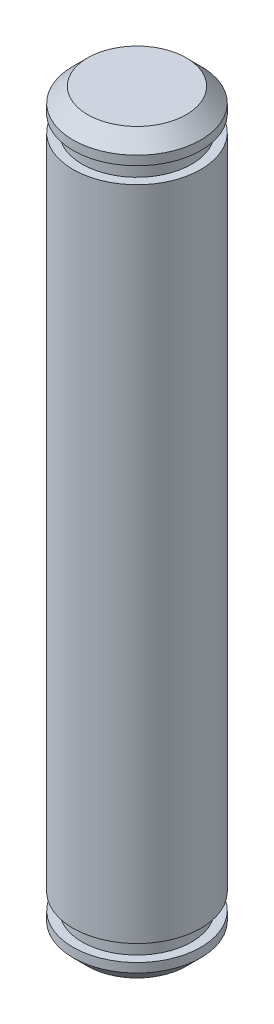
ISO-10303-21;
HEADER;
FILE_DESCRIPTION(('STEP AP214'),'2;1');
FILE_NAME('part.step','',(''),(''),'','','');
FILE_SCHEMA(('AUTOMOTIVE_DESIGN { 1 0 10303 214 1 1 1 1 }'));
ENDSEC;
DATA;
#1=APPLICATION_CONTEXT('core data for automotive mechanical design processes');
#2=APPLICATION_PROTOCOL_DEFINITION('international standard','automotive_design',2000,#1);
#3=PRODUCT_CONTEXT('',#1,'mechanical');
#4=PRODUCT('Part','Part','',(#3));
#5=PRODUCT_RELATED_PRODUCT_CATEGORY('part','',(#4));
#6=PRODUCT_DEFINITION_FORMATION('','',#4);
#7=PRODUCT_DEFINITION_CONTEXT('part definition',#1,'design');
#8=PRODUCT_DEFINITION('design','',#6,#7);
#9=PRODUCT_DEFINITION_SHAPE('','',#8);
#10=(LENGTH_UNIT() NAMED_UNIT(*) SI_UNIT(.MILLI.,.METRE.));
#11=(NAMED_UNIT(*) PLANE_ANGLE_UNIT() SI_UNIT($,.RADIAN.));
#12=(NAMED_UNIT(*) SI_UNIT($,.STERADIAN.) SOLID_ANGLE_UNIT());
#13=UNCERTAINTY_MEASURE_WITH_UNIT(LENGTH_MEASURE(1.E-05),#10,'distance_accuracy_value','');
#14=(GEOMETRIC_REPRESENTATION_CONTEXT(3) GLOBAL_UNCERTAINTY_ASSIGNED_CONTEXT((#13)) GLOBAL_UNIT_ASSIGNED_CONTEXT((#10,
#11,#12)) REPRESENTATION_CONTEXT('',''));
#15=CARTESIAN_POINT('',(0.,0.,0.));
#16=DIRECTION('',(0.,0.,1.));
#17=DIRECTION('',(1.,0.,0.));
#18=AXIS2_PLACEMENT_3D('',#15,#16,#17);
#19=CARTESIAN_POINT('',(0.689396407424145,-20.2,2.61050427952737));
#20=DIRECTION('',(0.,-1.,0.));
#21=DIRECTION('',(0.,0.,-1.));
#22=AXIS2_PLACEMENT_3D('',#19,#20,#21);
#23=PLANE('',#22);
#24=CARTESIAN_POINT('',(0.,-20.2,0.));
#25=DIRECTION('',(0.,1.,0.));
#26=DIRECTION('',(0.,0.,1.));
#27=AXIS2_PLACEMENT_3D('',#24,#25,#26);
#28=CIRCLE('',#27,2.7);
#29=CARTESIAN_POINT('',(0.,-20.2,2.7));
#30=VERTEX_POINT('',#29);
#31=EDGE_CURVE('E12',#30,#30,#28,.T.);
#32=ORIENTED_EDGE('',*,*,#31,.F.);
#33=EDGE_LOOP('',(#32));
#34=FACE_BOUND('',#33,.T.);
#35=ADVANCED_FACE('F39',(#34),#23,.T.);
#36=CARTESIAN_POINT('',(0.,-19.4,0.));
#37=DIRECTION('',(0.,1.,0.));
#38=DIRECTION('',(0.,0.,1.));
#39=AXIS2_PLACEMENT_3D('',#36,#37,#38);
#40=CONICAL_SURFACE('',#39,3.5,0.785398163397447);
#41=ORIENTED_EDGE('',*,*,#31,.T.);
#42=EDGE_LOOP('',(#41));
#43=FACE_BOUND('',#42,.T.);
#44=CARTESIAN_POINT('',(0.,-19.4,0.));
#45=DIRECTION('',(0.,1.,0.));
#46=DIRECTION('',(0.,0.,1.));
#47=AXIS2_PLACEMENT_3D('',#44,#45,#46);
#48=CIRCLE('',#47,3.5);
#49=CARTESIAN_POINT('',(0.,-19.4,3.5));
#50=VERTEX_POINT('',#49);
#51=EDGE_CURVE('E45',#50,#50,#48,.T.);
#52=ORIENTED_EDGE('',*,*,#51,.F.);
#53=EDGE_LOOP('',(#52));
#54=FACE_BOUND('',#53,.T.);
#55=ADVANCED_FACE('F99',(#43,#54),#40,.T.);
#56=CARTESIAN_POINT('',(0.,0.,0.));
#57=DIRECTION('',(0.,1.,0.));
#58=DIRECTION('',(0.,0.,1.));
#59=AXIS2_PLACEMENT_3D('',#56,#57,#58);
#60=CYLINDRICAL_SURFACE('',#59,3.5);
#61=ORIENTED_EDGE('',*,*,#51,.T.);
#62=EDGE_LOOP('',(#61));
#63=FACE_BOUND('',#62,.T.);
#64=CARTESIAN_POINT('',(0.,-18.9,0.));
#65=DIRECTION('',(0.,1.,0.));
#66=DIRECTION('',(0.,0.,1.));
#67=AXIS2_PLACEMENT_3D('',#64,#65,#66);
#68=CIRCLE('',#67,3.5);
#69=CARTESIAN_POINT('',(0.,-18.9,3.5));
#70=VERTEX_POINT('',#69);
#71=EDGE_CURVE('E49',#70,#70,#68,.T.);
#72=ORIENTED_EDGE('',*,*,#71,.F.);
#73=EDGE_LOOP('',(#72));
#74=FACE_BOUND('',#73,.T.);
#75=ADVANCED_FACE('F104',(#63,#74),#60,.T.);
#76=CARTESIAN_POINT('',(0.765996008249045,-18.9,2.90056031058596));
#77=DIRECTION('',(0.,1.,0.));
#78=DIRECTION('',(0.,0.,1.));
#79=AXIS2_PLACEMENT_3D('',#76,#77,#78);
#80=PLANE('',#79);
#81=ORIENTED_EDGE('',*,*,#71,.T.);
#82=EDGE_LOOP('',(#81));
#83=FACE_BOUND('',#82,.T.);
#84=CARTESIAN_POINT('',(0.,-18.9,0.));
#85=DIRECTION('',(0.,1.,0.));
#86=DIRECTION('',(0.,0.,1.));
#87=AXIS2_PLACEMENT_3D('',#84,#85,#86);
#88=CIRCLE('',#87,3.);
#89=CARTESIAN_POINT('',(0.,-18.9,3.));
#90=VERTEX_POINT('',#89);
#91=EDGE_CURVE('E53',#90,#90,#88,.T.);
#92=ORIENTED_EDGE('',*,*,#91,.F.);
#93=EDGE_LOOP('',(#92));
#94=FACE_BOUND('',#93,.T.);
#95=ADVANCED_FACE('F108',(#83,#94),#80,.T.);
#96=CARTESIAN_POINT('',(0.,0.,0.));
#97=DIRECTION('',(0.,1.,0.));
#98=DIRECTION('',(0.,0.,1.));
#99=AXIS2_PLACEMENT_3D('',#96,#97,#98);
#100=CYLINDRICAL_SURFACE('',#99,3.);
#101=ORIENTED_EDGE('',*,*,#91,.T.);
#102=EDGE_LOOP('',(#101));
#103=FACE_BOUND('',#102,.T.);
#104=CARTESIAN_POINT('',(0.,-18.,0.));
#105=DIRECTION('',(0.,1.,0.));
#106=DIRECTION('',(0.,0.,1.));
#107=AXIS2_PLACEMENT_3D('',#104,#105,#106);
#108=CIRCLE('',#107,3.);
#109=CARTESIAN_POINT('',(0.,-18.,3.));
#110=VERTEX_POINT('',#109);
#111=EDGE_CURVE('E58',#110,#110,#108,.T.);
#112=ORIENTED_EDGE('',*,*,#111,.F.);
#113=EDGE_LOOP('',(#112));
#114=FACE_BOUND('',#113,.T.);
#115=ADVANCED_FACE('F114',(#103,#114),#100,.T.);
#116=CARTESIAN_POINT('',(0.893662009623888,-18.,3.38398702901696));
#117=DIRECTION('',(0.,-1.,0.));
#118=DIRECTION('',(0.,0.,-1.));
#119=AXIS2_PLACEMENT_3D('',#116,#117,#118);
#120=PLANE('',#119);
#121=ORIENTED_EDGE('',*,*,#111,.T.);
#122=EDGE_LOOP('',(#121));
#123=FACE_BOUND('',#122,.T.);
#124=CARTESIAN_POINT('',(0.,-18.,0.));
#125=DIRECTION('',(0.,1.,0.));
#126=DIRECTION('',(0.,0.,1.));
#127=AXIS2_PLACEMENT_3D('',#124,#125,#126);
#128=CIRCLE('',#127,3.5);
#129=CARTESIAN_POINT('',(0.,-18.,3.5));
#130=VERTEX_POINT('',#129);
#131=EDGE_CURVE('E61',#130,#130,#128,.T.);
#132=ORIENTED_EDGE('',*,*,#131,.F.);
#133=EDGE_LOOP('',(#132));
#134=FACE_BOUND('',#133,.T.);
#135=ADVANCED_FACE('F118',(#123,#134),#120,.T.);
#136=CARTESIAN_POINT('',(0.,0.,0.));
#137=DIRECTION('',(0.,1.,0.));
#138=DIRECTION('',(0.,0.,1.));
#139=AXIS2_PLACEMENT_3D('',#136,#137,#138);
#140=CYLINDRICAL_SURFACE('',#139,3.5);
#141=ORIENTED_EDGE('',*,*,#131,.T.);
#142=EDGE_LOOP('',(#141));
#143=FACE_BOUND('',#142,.T.);
#144=CARTESIAN_POINT('',(0.,18.,0.));
#145=DIRECTION('',(0.,1.,0.));
#146=DIRECTION('',(0.,0.,1.));
#147=AXIS2_PLACEMENT_3D('',#144,#145,#146);
#148=CIRCLE('',#147,3.5);
#149=CARTESIAN_POINT('',(0.,18.,3.5));
#150=VERTEX_POINT('',#149);
#151=EDGE_CURVE('E64',#150,#150,#148,.T.);
#152=ORIENTED_EDGE('',*,*,#151,.F.);
#153=EDGE_LOOP('',(#152));
#154=FACE_BOUND('',#153,.T.);
#155=ADVANCED_FACE('F122',(#143,#154),#140,.T.);
#156=CARTESIAN_POINT('',(0.893662009623888,18.,3.38398702901696));
#157=DIRECTION('',(0.,1.,0.));
#158=DIRECTION('',(0.,0.,1.));
#159=AXIS2_PLACEMENT_3D('',#156,#157,#158);
#160=PLANE('',#159);
#161=ORIENTED_EDGE('',*,*,#151,.T.);
#162=EDGE_LOOP('',(#161));
#163=FACE_BOUND('',#162,.T.);
#164=CARTESIAN_POINT('',(0.,18.,0.));
#165=DIRECTION('',(0.,1.,0.));
#166=DIRECTION('',(0.,0.,1.));
#167=AXIS2_PLACEMENT_3D('',#164,#165,#166);
#168=CIRCLE('',#167,3.);
#169=CARTESIAN_POINT('',(0.,18.,3.));
#170=VERTEX_POINT('',#169);
#171=EDGE_CURVE('E67',#170,#170,#168,.T.);
#172=ORIENTED_EDGE('',*,*,#171,.F.);
#173=EDGE_LOOP('',(#172));
#174=FACE_BOUND('',#173,.T.);
#175=ADVANCED_FACE('F126',(#163,#174),#160,.T.);
#176=CARTESIAN_POINT('',(0.,0.,0.));
#177=DIRECTION('',(0.,1.,0.));
#178=DIRECTION('',(0.,0.,1.));
#179=AXIS2_PLACEMENT_3D('',#176,#177,#178);
#180=CYLINDRICAL_SURFACE('',#179,3.);
#181=ORIENTED_EDGE('',*,*,#171,.T.);
#182=EDGE_LOOP('',(#181));
#183=FACE_BOUND('',#182,.T.);
#184=CARTESIAN_POINT('',(0.,18.9,0.));
#185=DIRECTION('',(0.,1.,0.));
#186=DIRECTION('',(0.,0.,1.));
#187=AXIS2_PLACEMENT_3D('',#184,#185,#186);
#188=CIRCLE('',#187,3.);
#189=CARTESIAN_POINT('',(0.,18.9,3.));
#190=VERTEX_POINT('',#189);
#191=EDGE_CURVE('E70',#190,#190,#188,.T.);
#192=ORIENTED_EDGE('',*,*,#191,.F.);
#193=EDGE_LOOP('',(#192));
#194=FACE_BOUND('',#193,.T.);
#195=ADVANCED_FACE('F130',(#183,#194),#180,.T.);
#196=CARTESIAN_POINT('',(0.765996008249045,18.9,2.90056031058596));
#197=DIRECTION('',(0.,-1.,0.));
#198=DIRECTION('',(0.,0.,-1.));
#199=AXIS2_PLACEMENT_3D('',#196,#197,#198);
#200=PLANE('',#199);
#201=ORIENTED_EDGE('',*,*,#191,.T.);
#202=EDGE_LOOP('',(#201));
#203=FACE_BOUND('',#202,.T.);
#204=CARTESIAN_POINT('',(0.,18.9,0.));
#205=DIRECTION('',(0.,1.,0.));
#206=DIRECTION('',(0.,0.,1.));
#207=AXIS2_PLACEMENT_3D('',#204,#205,#206);
#208=CIRCLE('',#207,3.5);
#209=CARTESIAN_POINT('',(0.,18.9,3.5));
#210=VERTEX_POINT('',#209);
#211=EDGE_CURVE('E73',#210,#210,#208,.T.);
#212=ORIENTED_EDGE('',*,*,#211,.F.);
#213=EDGE_LOOP('',(#212));
#214=FACE_BOUND('',#213,.T.);
#215=ADVANCED_FACE('F95',(#203,#214),#200,.T.);
#216=CARTESIAN_POINT('',(0.,0.,0.));
#217=DIRECTION('',(0.,1.,0.));
#218=DIRECTION('',(0.,0.,1.));
#219=AXIS2_PLACEMENT_3D('',#216,#217,#218);
#220=CYLINDRICAL_SURFACE('',#219,3.5);
#221=ORIENTED_EDGE('',*,*,#211,.T.);
#222=EDGE_LOOP('',(#221));
#223=FACE_BOUND('',#222,.T.);
#224=CARTESIAN_POINT('',(0.,19.4,0.));
#225=DIRECTION('',(0.,1.,0.));
#226=DIRECTION('',(0.,0.,1.));
#227=AXIS2_PLACEMENT_3D('',#224,#225,#226);
#228=CIRCLE('',#227,3.5);
#229=CARTESIAN_POINT('',(0.,19.4,3.5));
#230=VERTEX_POINT('',#229);
#231=EDGE_CURVE('E76',#230,#230,#228,.T.);
#232=ORIENTED_EDGE('',*,*,#231,.F.);
#233=EDGE_LOOP('',(#232));
#234=FACE_BOUND('',#233,.T.);
#235=ADVANCED_FACE('F87',(#223,#234),#220,.T.);
#236=CARTESIAN_POINT('',(0.,20.2,0.));
#237=DIRECTION('',(0.,-1.,0.));
#238=DIRECTION('',(0.,0.,-1.));
#239=AXIS2_PLACEMENT_3D('',#236,#237,#238);
#240=CONICAL_SURFACE('',#239,2.7,0.785398163397447);
#241=ORIENTED_EDGE('',*,*,#231,.T.);
#242=EDGE_LOOP('',(#241));
#243=FACE_BOUND('',#242,.T.);
#244=CARTESIAN_POINT('',(0.,20.2,0.));
#245=DIRECTION('',(0.,1.,0.));
#246=DIRECTION('',(0.,0.,1.));
#247=AXIS2_PLACEMENT_3D('',#244,#245,#246);
#248=CIRCLE('',#247,2.7);
#249=CARTESIAN_POINT('',(0.,20.2,2.7));
#250=VERTEX_POINT('',#249);
#251=EDGE_CURVE('E79',#250,#250,#248,.T.);
#252=ORIENTED_EDGE('',*,*,#251,.F.);
#253=EDGE_LOOP('',(#252));
#254=FACE_BOUND('',#253,.T.);
#255=ADVANCED_FACE('F85',(#243,#254),#240,.T.);
#256=CARTESIAN_POINT('',(0.689396407424145,20.2,2.61050427952737));
#257=DIRECTION('',(0.,1.,0.));
#258=DIRECTION('',(0.,0.,1.));
#259=AXIS2_PLACEMENT_3D('',#256,#257,#258);
#260=PLANE('',#259);
#261=ORIENTED_EDGE('',*,*,#251,.T.);
#262=EDGE_LOOP('',(#261));
#263=FACE_BOUND('',#262,.T.);
#264=ADVANCED_FACE('F83',(#263),#260,.T.);
#265=CLOSED_SHELL('',(#35,#55,#75,#95,#115,#135,#155,#175,#195,#215,#235,#255,#264));
#266=MANIFOLD_SOLID_BREP('B2',#265);
#267=ADVANCED_BREP_SHAPE_REPRESENTATION('',(#18,#266),#14);
#268=SHAPE_DEFINITION_REPRESENTATION(#9,#267);
ENDSEC;
END-ISO-10303-21;
